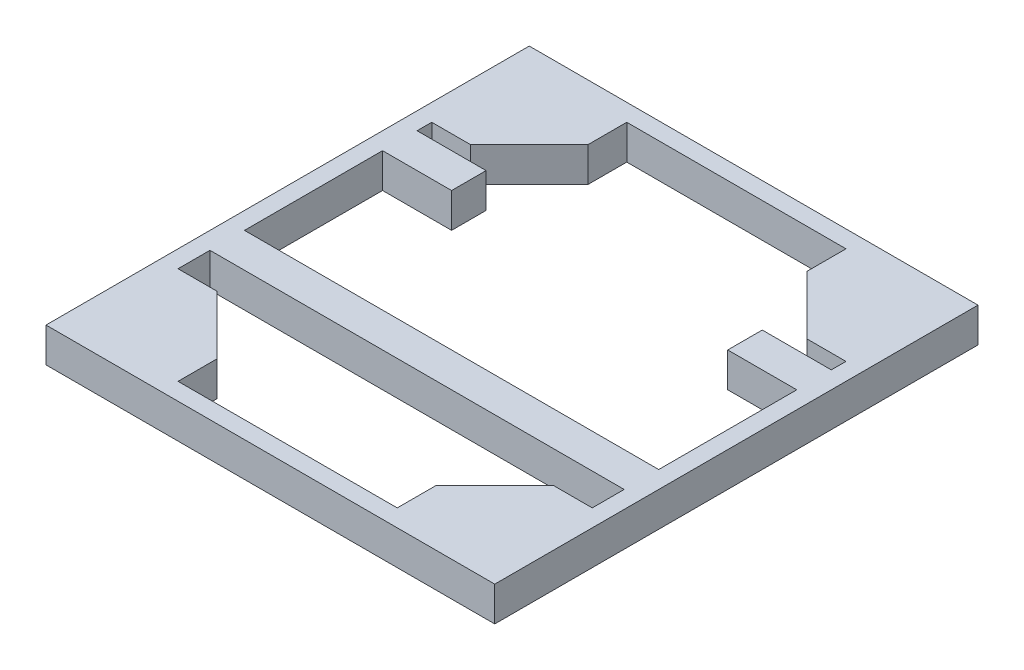
ISO-10303-21;
HEADER;
FILE_DESCRIPTION(('STEP AP214'),'2;1');
FILE_NAME('part.step','',(''),(''),'','','');
FILE_SCHEMA(('AUTOMOTIVE_DESIGN { 1 0 10303 214 1 1 1 1 }'));
ENDSEC;
DATA;
#1=APPLICATION_CONTEXT('core data for automotive mechanical design processes');
#2=APPLICATION_PROTOCOL_DEFINITION('international standard','automotive_design',2000,#1);
#3=PRODUCT_CONTEXT('',#1,'mechanical');
#4=PRODUCT('Part','Part','',(#3));
#5=PRODUCT_RELATED_PRODUCT_CATEGORY('part','',(#4));
#6=PRODUCT_DEFINITION_FORMATION('','',#4);
#7=PRODUCT_DEFINITION_CONTEXT('part definition',#1,'design');
#8=PRODUCT_DEFINITION('design','',#6,#7);
#9=PRODUCT_DEFINITION_SHAPE('','',#8);
#10=(LENGTH_UNIT() NAMED_UNIT(*) SI_UNIT(.MILLI.,.METRE.));
#11=(NAMED_UNIT(*) PLANE_ANGLE_UNIT() SI_UNIT($,.RADIAN.));
#12=(NAMED_UNIT(*) SI_UNIT($,.STERADIAN.) SOLID_ANGLE_UNIT());
#13=UNCERTAINTY_MEASURE_WITH_UNIT(LENGTH_MEASURE(1.E-05),#10,'distance_accuracy_value','');
#14=(GEOMETRIC_REPRESENTATION_CONTEXT(3) GLOBAL_UNCERTAINTY_ASSIGNED_CONTEXT((#13)) GLOBAL_UNIT_ASSIGNED_CONTEXT((#10,
#11,#12)) REPRESENTATION_CONTEXT('',''));
#15=CARTESIAN_POINT('',(0.,0.,0.));
#16=DIRECTION('',(0.,0.,1.));
#17=DIRECTION('',(1.,0.,0.));
#18=AXIS2_PLACEMENT_3D('',#15,#16,#17);
#19=CARTESIAN_POINT('',(0.,0.,-469.9));
#20=DIRECTION('',(0.,0.,-1.));
#21=DIRECTION('',(-1.,0.,0.));
#22=AXIS2_PLACEMENT_3D('',#19,#20,#21);
#23=PLANE('',#22);
#24=DIRECTION('',(-1.,0.,0.));
#25=VECTOR('',#24,1.);
#26=CARTESIAN_POINT('',(0.,50.8,-469.9));
#27=LINE('',#26,#25);
#28=CARTESIAN_POINT('',(635.,50.8,-469.9));
#29=VERTEX_POINT('',#28);
#30=CARTESIAN_POINT('',(533.4,50.8,-469.9));
#31=VERTEX_POINT('',#30);
#32=EDGE_CURVE('E272',#29,#31,#27,.T.);
#33=ORIENTED_EDGE('',*,*,#32,.T.);
#34=DIRECTION('',(0.,1.,0.));
#35=VECTOR('',#34,1.);
#36=CARTESIAN_POINT('',(533.4,0.,-469.9));
#37=LINE('',#36,#35);
#38=CARTESIAN_POINT('',(533.4,0.,-469.9));
#39=VERTEX_POINT('',#38);
#40=EDGE_CURVE('E565',#39,#31,#37,.T.);
#41=ORIENTED_EDGE('',*,*,#40,.F.);
#42=DIRECTION('',(-1.,0.,0.));
#43=VECTOR('',#42,1.);
#44=CARTESIAN_POINT('',(0.,0.,-469.9));
#45=LINE('',#44,#43);
#46=CARTESIAN_POINT('',(635.,0.,-469.9));
#47=VERTEX_POINT('',#46);
#48=EDGE_CURVE('E262',#47,#39,#45,.T.);
#49=ORIENTED_EDGE('',*,*,#48,.F.);
#50=DIRECTION('',(0.,1.,0.));
#51=VECTOR('',#50,1.);
#52=CARTESIAN_POINT('',(635.,0.,-469.9));
#53=LINE('',#52,#51);
#54=EDGE_CURVE('E281',#47,#29,#53,.T.);
#55=ORIENTED_EDGE('',*,*,#54,.T.);
#56=EDGE_LOOP('',(#33,#41,#49,#55));
#57=FACE_BOUND('',#56,.T.);
#58=ADVANCED_FACE('F35',(#57),#23,.F.);
#59=CARTESIAN_POINT('',(0.,0.,-520.7));
#60=DIRECTION('',(0.,0.,-1.));
#61=DIRECTION('',(-1.,0.,0.));
#62=AXIS2_PLACEMENT_3D('',#59,#60,#61);
#63=PLANE('',#62);
#64=DIRECTION('',(0.,1.,0.));
#65=VECTOR('',#64,1.);
#66=CARTESIAN_POINT('',(533.4,0.,-520.7));
#67=LINE('',#66,#65);
#68=CARTESIAN_POINT('',(533.4,0.,-520.7));
#69=VERTEX_POINT('',#68);
#70=CARTESIAN_POINT('',(533.4,50.8,-520.7));
#71=VERTEX_POINT('',#70);
#72=EDGE_CURVE('E243',#69,#71,#67,.T.);
#73=ORIENTED_EDGE('',*,*,#72,.T.);
#74=DIRECTION('',(-1.,0.,0.));
#75=VECTOR('',#74,1.);
#76=CARTESIAN_POINT('',(0.,50.8,-520.7));
#77=LINE('',#76,#75);
#78=CARTESIAN_POINT('',(635.,50.8,-520.7));
#79=VERTEX_POINT('',#78);
#80=EDGE_CURVE('E275',#79,#71,#77,.T.);
#81=ORIENTED_EDGE('',*,*,#80,.F.);
#82=DIRECTION('',(0.,1.,0.));
#83=VECTOR('',#82,1.);
#84=CARTESIAN_POINT('',(635.,0.,-520.7));
#85=LINE('',#84,#83);
#86=CARTESIAN_POINT('',(635.,0.,-520.7));
#87=VERTEX_POINT('',#86);
#88=EDGE_CURVE('E267',#87,#79,#85,.T.);
#89=ORIENTED_EDGE('',*,*,#88,.F.);
#90=DIRECTION('',(-1.,0.,0.));
#91=VECTOR('',#90,1.);
#92=CARTESIAN_POINT('',(0.,0.,-520.7));
#93=LINE('',#92,#91);
#94=EDGE_CURVE('E260',#87,#69,#93,.T.);
#95=ORIENTED_EDGE('',*,*,#94,.T.);
#96=EDGE_LOOP('',(#73,#81,#89,#95));
#97=FACE_BOUND('',#96,.T.);
#98=ADVANCED_FACE('F266',(#97),#63,.T.);
#99=CARTESIAN_POINT('',(25.3999999999999,50.8,0.));
#100=DIRECTION('',(1.,0.,0.));
#101=DIRECTION('',(0.,0.,-1.));
#102=AXIS2_PLACEMENT_3D('',#99,#100,#101);
#103=PLANE('',#102);
#104=DIRECTION('',(0.,0.,1.));
#105=VECTOR('',#104,1.);
#106=CARTESIAN_POINT('',(25.3999999999999,0.,0.));
#107=LINE('',#106,#105);
#108=CARTESIAN_POINT('',(25.3999999999999,0.,-469.9));
#109=VERTEX_POINT('',#108);
#110=CARTESIAN_POINT('',(25.3999999999999,0.,-266.7));
#111=VERTEX_POINT('',#110);
#112=EDGE_CURVE('E390',#109,#111,#107,.T.);
#113=ORIENTED_EDGE('',*,*,#112,.F.);
#114=DIRECTION('',(0.,1.,0.));
#115=VECTOR('',#114,1.);
#116=CARTESIAN_POINT('',(25.3999999999999,0.,-469.9));
#117=LINE('',#116,#115);
#118=CARTESIAN_POINT('',(25.3999999999999,50.8,-469.9));
#119=VERTEX_POINT('',#118);
#120=EDGE_CURVE('E285',#109,#119,#117,.T.);
#121=ORIENTED_EDGE('',*,*,#120,.T.);
#122=DIRECTION('',(0.,0.,1.));
#123=VECTOR('',#122,1.);
#124=CARTESIAN_POINT('',(25.3999999999999,50.8,0.));
#125=LINE('',#124,#123);
#126=CARTESIAN_POINT('',(25.3999999999999,50.8,-266.7));
#127=VERTEX_POINT('',#126);
#128=EDGE_CURVE('E333',#119,#127,#125,.T.);
#129=ORIENTED_EDGE('',*,*,#128,.T.);
#130=DIRECTION('',(0.,1.,0.));
#131=VECTOR('',#130,1.);
#132=CARTESIAN_POINT('',(25.3999999999999,0.,-266.7));
#133=LINE('',#132,#131);
#134=EDGE_CURVE('E310',#111,#127,#133,.T.);
#135=ORIENTED_EDGE('',*,*,#134,.F.);
#136=EDGE_LOOP('',(#113,#121,#129,#135));
#137=FACE_BOUND('',#136,.T.);
#138=ADVANCED_FACE('F526',(#137),#103,.T.);
#139=CARTESIAN_POINT('',(635.,50.8,0.));
#140=DIRECTION('',(1.,0.,0.));
#141=DIRECTION('',(0.,0.,-1.));
#142=AXIS2_PLACEMENT_3D('',#139,#140,#141);
#143=PLANE('',#142);
#144=ORIENTED_EDGE('',*,*,#54,.F.);
#145=DIRECTION('',(0.,0.,1.));
#146=VECTOR('',#145,1.);
#147=CARTESIAN_POINT('',(635.,0.,0.));
#148=LINE('',#147,#146);
#149=CARTESIAN_POINT('',(635.,0.,-266.7));
#150=VERTEX_POINT('',#149);
#151=EDGE_CURVE('E412',#47,#150,#148,.T.);
#152=ORIENTED_EDGE('',*,*,#151,.T.);
#153=DIRECTION('',(0.,1.,0.));
#154=VECTOR('',#153,1.);
#155=CARTESIAN_POINT('',(635.,0.,-266.7));
#156=LINE('',#155,#154);
#157=CARTESIAN_POINT('',(635.,50.8,-266.7));
#158=VERTEX_POINT('',#157);
#159=EDGE_CURVE('E299',#150,#158,#156,.T.);
#160=ORIENTED_EDGE('',*,*,#159,.T.);
#161=DIRECTION('',(0.,0.,1.));
#162=VECTOR('',#161,1.);
#163=CARTESIAN_POINT('',(635.,50.8,0.));
#164=LINE('',#163,#162);
#165=EDGE_CURVE('E355',#29,#158,#164,.T.);
#166=ORIENTED_EDGE('',*,*,#165,.F.);
#167=EDGE_LOOP('',(#144,#152,#160,#166));
#168=FACE_BOUND('',#167,.T.);
#169=ADVANCED_FACE('F512',(#168),#143,.F.);
#170=CARTESIAN_POINT('',(25.3999999999999,0.,-215.9));
#171=VERTEX_POINT('',#170);
#172=CARTESIAN_POINT('',(25.3999999999999,0.,-168.897171389936));
#173=VERTEX_POINT('',#172);
#174=EDGE_CURVE('E385',#171,#173,#107,.T.);
#175=ORIENTED_EDGE('',*,*,#174,.F.);
#176=DIRECTION('',(0.,1.,0.));
#177=VECTOR('',#176,1.);
#178=CARTESIAN_POINT('',(25.3999999999999,0.,-215.9));
#179=LINE('',#178,#177);
#180=CARTESIAN_POINT('',(25.3999999999999,50.8,-215.9));
#181=VERTEX_POINT('',#180);
#182=EDGE_CURVE('E307',#171,#181,#179,.T.);
#183=ORIENTED_EDGE('',*,*,#182,.T.);
#184=CARTESIAN_POINT('',(25.3999999999999,50.8,-168.897171389936));
#185=VERTEX_POINT('',#184);
#186=EDGE_CURVE('E328',#181,#185,#125,.T.);
#187=ORIENTED_EDGE('',*,*,#186,.T.);
#188=DIRECTION('',(0.,-1.,0.));
#189=VECTOR('',#188,1.);
#190=CARTESIAN_POINT('',(25.3999999999999,50.8,-168.897171389936));
#191=LINE('',#190,#189);
#192=EDGE_CURVE('E464',#185,#173,#191,.T.);
#193=ORIENTED_EDGE('',*,*,#192,.T.);
#194=EDGE_LOOP('',(#175,#183,#187,#193));
#195=FACE_BOUND('',#194,.T.);
#196=ADVANCED_FACE('F524',(#195),#103,.T.);
#197=DIRECTION('',(0.,1.,0.));
#198=VECTOR('',#197,1.);
#199=CARTESIAN_POINT('',(635.,0.,-215.9));
#200=LINE('',#199,#198);
#201=CARTESIAN_POINT('',(635.,0.,-215.9));
#202=VERTEX_POINT('',#201);
#203=CARTESIAN_POINT('',(635.,50.8,-215.9));
#204=VERTEX_POINT('',#203);
#205=EDGE_CURVE('E303',#202,#204,#200,.T.);
#206=ORIENTED_EDGE('',*,*,#205,.F.);
#207=CARTESIAN_POINT('',(635.,0.,-168.897171389936));
#208=VERTEX_POINT('',#207);
#209=EDGE_CURVE('E408',#202,#208,#148,.T.);
#210=ORIENTED_EDGE('',*,*,#209,.T.);
#211=DIRECTION('',(0.,-1.,0.));
#212=VECTOR('',#211,1.);
#213=CARTESIAN_POINT('',(635.,50.8,-168.897171389936));
#214=LINE('',#213,#212);
#215=CARTESIAN_POINT('',(635.,50.8,-168.897171389936));
#216=VERTEX_POINT('',#215);
#217=EDGE_CURVE('E442',#216,#208,#214,.T.);
#218=ORIENTED_EDGE('',*,*,#217,.F.);
#219=EDGE_CURVE('E350',#204,#216,#164,.T.);
#220=ORIENTED_EDGE('',*,*,#219,.F.);
#221=EDGE_LOOP('',(#206,#210,#218,#220));
#222=FACE_BOUND('',#221,.T.);
#223=ADVANCED_FACE('F507',(#222),#143,.F.);
#224=CARTESIAN_POINT('',(0.,50.8,0.));
#225=DIRECTION('',(0.,0.,-1.));
#226=DIRECTION('',(-1.,0.,0.));
#227=AXIS2_PLACEMENT_3D('',#224,#225,#226);
#228=PLANE('',#227);
#229=DIRECTION('',(1.,0.,0.));
#230=VECTOR('',#229,1.);
#231=CARTESIAN_POINT('',(0.,0.,0.));
#232=LINE('',#231,#230);
#233=CARTESIAN_POINT('',(0.,0.,0.));
#234=VERTEX_POINT('',#233);
#235=CARTESIAN_POINT('',(660.4,0.,0.));
#236=VERTEX_POINT('',#235);
#237=EDGE_CURVE('E420',#234,#236,#232,.T.);
#238=ORIENTED_EDGE('',*,*,#237,.T.);
#239=DIRECTION('',(0.,-1.,0.));
#240=VECTOR('',#239,1.);
#241=CARTESIAN_POINT('',(660.4,50.8,0.));
#242=LINE('',#241,#240);
#243=CARTESIAN_POINT('',(660.4,50.8,0.));
#244=VERTEX_POINT('',#243);
#245=EDGE_CURVE('E11',#244,#236,#242,.T.);
#246=ORIENTED_EDGE('',*,*,#245,.F.);
#247=DIRECTION('',(1.,0.,0.));
#248=VECTOR('',#247,1.);
#249=CARTESIAN_POINT('',(0.,50.8,0.));
#250=LINE('',#249,#248);
#251=CARTESIAN_POINT('',(0.,50.8,0.));
#252=VERTEX_POINT('',#251);
#253=EDGE_CURVE('E362',#252,#244,#250,.T.);
#254=ORIENTED_EDGE('',*,*,#253,.F.);
#255=DIRECTION('',(0.,-1.,0.));
#256=VECTOR('',#255,1.);
#257=CARTESIAN_POINT('',(0.,50.8,0.));
#258=LINE('',#257,#256);
#259=EDGE_CURVE('E431',#252,#234,#258,.T.);
#260=ORIENTED_EDGE('',*,*,#259,.T.);
#261=EDGE_LOOP('',(#238,#246,#254,#260));
#262=FACE_BOUND('',#261,.T.);
#263=ADVANCED_FACE('F668',(#262),#228,.F.);
#264=CARTESIAN_POINT('',(660.4,50.8,0.));
#265=DIRECTION('',(-1.,0.,0.));
#266=DIRECTION('',(0.,0.,1.));
#267=AXIS2_PLACEMENT_3D('',#264,#265,#266);
#268=PLANE('',#267);
#269=DIRECTION('',(0.,0.,-1.));
#270=VECTOR('',#269,1.);
#271=CARTESIAN_POINT('',(660.4,0.,0.));
#272=LINE('',#271,#270);
#273=CARTESIAN_POINT('',(660.4,0.,-711.2));
#274=VERTEX_POINT('',#273);
#275=EDGE_CURVE('E423',#236,#274,#272,.T.);
#276=ORIENTED_EDGE('',*,*,#275,.T.);
#277=DIRECTION('',(0.,-1.,0.));
#278=VECTOR('',#277,1.);
#279=CARTESIAN_POINT('',(660.4,50.8,-711.2));
#280=LINE('',#279,#278);
#281=CARTESIAN_POINT('',(660.4,50.8,-711.2));
#282=VERTEX_POINT('',#281);
#283=EDGE_CURVE('E44',#282,#274,#280,.T.);
#284=ORIENTED_EDGE('',*,*,#283,.F.);
#285=DIRECTION('',(0.,0.,-1.));
#286=VECTOR('',#285,1.);
#287=CARTESIAN_POINT('',(660.4,50.8,0.));
#288=LINE('',#287,#286);
#289=EDGE_CURVE('E365',#244,#282,#288,.T.);
#290=ORIENTED_EDGE('',*,*,#289,.F.);
#291=ORIENTED_EDGE('',*,*,#245,.T.);
#292=EDGE_LOOP('',(#276,#284,#290,#291));
#293=FACE_BOUND('',#292,.T.);
#294=ADVANCED_FACE('F823',(#293),#268,.F.);
#295=CARTESIAN_POINT('',(0.,50.8,-711.2));
#296=DIRECTION('',(0.,0.,-1.));
#297=DIRECTION('',(-1.,0.,0.));
#298=AXIS2_PLACEMENT_3D('',#295,#296,#297);
#299=PLANE('',#298);
#300=DIRECTION('',(1.,0.,0.));
#301=VECTOR('',#300,1.);
#302=CARTESIAN_POINT('',(0.,0.,-711.2));
#303=LINE('',#302,#301);
#304=CARTESIAN_POINT('',(0.,0.,-711.2));
#305=VERTEX_POINT('',#304);
#306=EDGE_CURVE('E426',#305,#274,#303,.T.);
#307=ORIENTED_EDGE('',*,*,#306,.F.);
#308=DIRECTION('',(0.,-1.,0.));
#309=VECTOR('',#308,1.);
#310=CARTESIAN_POINT('',(0.,50.8,-711.2));
#311=LINE('',#310,#309);
#312=CARTESIAN_POINT('',(0.,50.8,-711.2));
#313=VERTEX_POINT('',#312);
#314=EDGE_CURVE('E433',#313,#305,#311,.T.);
#315=ORIENTED_EDGE('',*,*,#314,.F.);
#316=DIRECTION('',(1.,0.,0.));
#317=VECTOR('',#316,1.);
#318=CARTESIAN_POINT('',(0.,50.8,-711.2));
#319=LINE('',#318,#317);
#320=EDGE_CURVE('E367',#313,#282,#319,.T.);
#321=ORIENTED_EDGE('',*,*,#320,.T.);
#322=ORIENTED_EDGE('',*,*,#283,.T.);
#323=EDGE_LOOP('',(#307,#315,#321,#322));
#324=FACE_BOUND('',#323,.T.);
#325=ADVANCED_FACE('F815',(#324),#299,.T.);
#326=CARTESIAN_POINT('',(0.,50.8,-25.4));
#327=DIRECTION('',(0.,0.,-1.));
#328=DIRECTION('',(-1.,0.,0.));
#329=AXIS2_PLACEMENT_3D('',#326,#327,#328);
#330=PLANE('',#329);
#331=DIRECTION('',(1.,0.,0.));
#332=VECTOR('',#331,1.);
#333=CARTESIAN_POINT('',(0.,0.,-25.4));
#334=LINE('',#333,#332);
#335=CARTESIAN_POINT('',(168.897171389937,0.,-25.4));
#336=VERTEX_POINT('',#335);
#337=CARTESIAN_POINT('',(491.502828610063,0.,-25.4));
#338=VERTEX_POINT('',#337);
#339=EDGE_CURVE('E306',#336,#338,#334,.T.);
#340=ORIENTED_EDGE('',*,*,#339,.F.);
#341=DIRECTION('',(0.,-1.,0.));
#342=VECTOR('',#341,1.);
#343=CARTESIAN_POINT('',(168.897171389937,50.8,-25.4));
#344=LINE('',#343,#342);
#345=CARTESIAN_POINT('',(168.897171389937,50.8,-25.4));
#346=VERTEX_POINT('',#345);
#347=EDGE_CURVE('E39',#346,#336,#344,.T.);
#348=ORIENTED_EDGE('',*,*,#347,.F.);
#349=DIRECTION('',(1.,0.,0.));
#350=VECTOR('',#349,1.);
#351=CARTESIAN_POINT('',(0.,50.8,-25.4));
#352=LINE('',#351,#350);
#353=CARTESIAN_POINT('',(491.502828610063,50.8,-25.4));
#354=VERTEX_POINT('',#353);
#355=EDGE_CURVE('E315',#346,#354,#352,.T.);
#356=ORIENTED_EDGE('',*,*,#355,.T.);
#357=DIRECTION('',(0.,-1.,0.));
#358=VECTOR('',#357,1.);
#359=CARTESIAN_POINT('',(491.502828610063,50.8,-25.4));
#360=LINE('',#359,#358);
#361=EDGE_CURVE('E373',#354,#338,#360,.T.);
#362=ORIENTED_EDGE('',*,*,#361,.T.);
#363=EDGE_LOOP('',(#340,#348,#356,#362));
#364=FACE_BOUND('',#363,.T.);
#365=ADVANCED_FACE('F37',(#364),#330,.T.);
#366=CARTESIAN_POINT('',(168.897171389937,50.8,1.2304037301258E-12));
#367=DIRECTION('',(1.,0.,0.));
#368=DIRECTION('',(0.,0.,-1.));
#369=AXIS2_PLACEMENT_3D('',#366,#367,#368);
#370=PLANE('',#369);
#371=DIRECTION('',(0.,0.,1.));
#372=VECTOR('',#371,1.);
#373=CARTESIAN_POINT('',(168.897171389937,0.,1.2304037301258E-12));
#374=LINE('',#373,#372);
#375=CARTESIAN_POINT('',(168.897171389937,0.,-82.5499999999992));
#376=VERTEX_POINT('',#375);
#377=EDGE_CURVE('E376',#376,#336,#374,.T.);
#378=ORIENTED_EDGE('',*,*,#377,.F.);
#379=DIRECTION('',(0.,-1.,0.));
#380=VECTOR('',#379,1.);
#381=CARTESIAN_POINT('',(168.897171389937,50.8,-82.5499999999992));
#382=LINE('',#381,#380);
#383=CARTESIAN_POINT('',(168.897171389937,50.8,-82.5499999999992));
#384=VERTEX_POINT('',#383);
#385=EDGE_CURVE('E468',#384,#376,#382,.T.);
#386=ORIENTED_EDGE('',*,*,#385,.F.);
#387=DIRECTION('',(0.,0.,1.));
#388=VECTOR('',#387,1.);
#389=CARTESIAN_POINT('',(168.897171389937,50.8,1.2304037301258E-12));
#390=LINE('',#389,#388);
#391=EDGE_CURVE('E318',#384,#346,#390,.T.);
#392=ORIENTED_EDGE('',*,*,#391,.T.);
#393=ORIENTED_EDGE('',*,*,#347,.T.);
#394=EDGE_LOOP('',(#378,#386,#392,#393));
#395=FACE_BOUND('',#394,.T.);
#396=ADVANCED_FACE('F474',(#395),#370,.T.);
#397=CARTESIAN_POINT('',(125.723585694968,50.8,-125.723585694968));
#398=DIRECTION('',(0.707106781186549,0.,-0.707106781186546));
#399=DIRECTION('',(-0.707106781186546,0.,-0.707106781186549));
#400=AXIS2_PLACEMENT_3D('',#397,#398,#399);
#401=PLANE('',#400);
#402=DIRECTION('',(0.707106781186546,0.,0.707106781186549));
#403=VECTOR('',#402,1.);
#404=CARTESIAN_POINT('',(125.723585694968,0.,-125.723585694968));
#405=LINE('',#404,#403);
#406=CARTESIAN_POINT('',(82.5500000000016,0.,-168.897171389935));
#407=VERTEX_POINT('',#406);
#408=EDGE_CURVE('E379',#407,#376,#405,.T.);
#409=ORIENTED_EDGE('',*,*,#408,.F.);
#410=DIRECTION('',(0.,-1.,0.));
#411=VECTOR('',#410,1.);
#412=CARTESIAN_POINT('',(82.5500000000016,50.8,-168.897171389935));
#413=LINE('',#412,#411);
#414=CARTESIAN_POINT('',(82.5500000000016,50.8,-168.897171389935));
#415=VERTEX_POINT('',#414);
#416=EDGE_CURVE('E467',#415,#407,#413,.T.);
#417=ORIENTED_EDGE('',*,*,#416,.F.);
#418=DIRECTION('',(0.707106781186546,0.,0.707106781186549));
#419=VECTOR('',#418,1.);
#420=CARTESIAN_POINT('',(125.723585694968,50.8,-125.723585694968));
#421=LINE('',#420,#419);
#422=EDGE_CURVE('E322',#415,#384,#421,.T.);
#423=ORIENTED_EDGE('',*,*,#422,.T.);
#424=ORIENTED_EDGE('',*,*,#385,.T.);
#425=EDGE_LOOP('',(#409,#417,#423,#424));
#426=FACE_BOUND('',#425,.T.);
#427=ADVANCED_FACE('F482',(#426),#401,.T.);
#428=CARTESIAN_POINT('',(4.59350725913613E-12,50.8,-168.897171389937));
#429=DIRECTION('',(0.,0.,1.));
#430=DIRECTION('',(1.,0.,0.));
#431=AXIS2_PLACEMENT_3D('',#428,#429,#430);
#432=PLANE('',#431);
#433=DIRECTION('',(-1.,0.,0.));
#434=VECTOR('',#433,1.);
#435=CARTESIAN_POINT('',(4.59350725913613E-12,0.,-168.897171389937));
#436=LINE('',#435,#434);
#437=EDGE_CURVE('E382',#407,#173,#436,.T.);
#438=ORIENTED_EDGE('',*,*,#437,.T.);
#439=ORIENTED_EDGE('',*,*,#192,.F.);
#440=DIRECTION('',(-1.,0.,0.));
#441=VECTOR('',#440,1.);
#442=CARTESIAN_POINT('',(4.59350725913613E-12,50.8,-168.897171389937));
#443=LINE('',#442,#441);
#444=EDGE_CURVE('E325',#415,#185,#443,.T.);
#445=ORIENTED_EDGE('',*,*,#444,.F.);
#446=ORIENTED_EDGE('',*,*,#416,.T.);
#447=EDGE_LOOP('',(#438,#439,#445,#446));
#448=FACE_BOUND('',#447,.T.);
#449=ADVANCED_FACE('F487',(#448),#432,.F.);
#450=DIRECTION('',(0.,1.,0.));
#451=VECTOR('',#450,1.);
#452=CARTESIAN_POINT('',(25.3999999999999,0.,-520.7));
#453=LINE('',#452,#451);
#454=CARTESIAN_POINT('',(25.3999999999999,0.,-520.7));
#455=VERTEX_POINT('',#454);
#456=CARTESIAN_POINT('',(25.3999999999999,50.8,-520.7));
#457=VERTEX_POINT('',#456);
#458=EDGE_CURVE('E288',#455,#457,#453,.T.);
#459=ORIENTED_EDGE('',*,*,#458,.F.);
#460=CARTESIAN_POINT('',(25.3999999999999,0.,-542.302828610064));
#461=VERTEX_POINT('',#460);
#462=EDGE_CURVE('E386',#461,#455,#107,.T.);
#463=ORIENTED_EDGE('',*,*,#462,.F.);
#464=DIRECTION('',(0.,-1.,0.));
#465=VECTOR('',#464,1.);
#466=CARTESIAN_POINT('',(25.3999999999999,50.8,-542.302828610064));
#467=LINE('',#466,#465);
#468=CARTESIAN_POINT('',(25.3999999999999,50.8,-542.302828610064));
#469=VERTEX_POINT('',#468);
#470=EDGE_CURVE('E462',#469,#461,#467,.T.);
#471=ORIENTED_EDGE('',*,*,#470,.F.);
#472=EDGE_CURVE('E329',#469,#457,#125,.T.);
#473=ORIENTED_EDGE('',*,*,#472,.T.);
#474=EDGE_LOOP('',(#459,#463,#471,#473));
#475=FACE_BOUND('',#474,.T.);
#476=ADVANCED_FACE('F649',(#475),#103,.T.);
#477=CARTESIAN_POINT('',(-1.47490449921105E-11,50.8,-542.302828610063));
#478=DIRECTION('',(0.,0.,1.));
#479=DIRECTION('',(1.,0.,0.));
#480=AXIS2_PLACEMENT_3D('',#477,#478,#479);
#481=PLANE('',#480);
#482=DIRECTION('',(-1.,0.,0.));
#483=VECTOR('',#482,1.);
#484=CARTESIAN_POINT('',(-1.47490449921105E-11,0.,-542.302828610063));
#485=LINE('',#484,#483);
#486=CARTESIAN_POINT('',(82.5500000000016,0.,-542.302828610065));
#487=VERTEX_POINT('',#486);
#488=EDGE_CURVE('E389',#487,#461,#485,.T.);
#489=ORIENTED_EDGE('',*,*,#488,.F.);
#490=DIRECTION('',(0.,-1.,0.));
#491=VECTOR('',#490,1.);
#492=CARTESIAN_POINT('',(82.5500000000016,50.8,-542.302828610065));
#493=LINE('',#492,#491);
#494=CARTESIAN_POINT('',(82.5500000000016,50.8,-542.302828610065));
#495=VERTEX_POINT('',#494);
#496=EDGE_CURVE('E460',#495,#487,#493,.T.);
#497=ORIENTED_EDGE('',*,*,#496,.F.);
#498=DIRECTION('',(-1.,0.,0.));
#499=VECTOR('',#498,1.);
#500=CARTESIAN_POINT('',(-1.47490449921105E-11,50.8,-542.302828610063));
#501=LINE('',#500,#499);
#502=EDGE_CURVE('E332',#495,#469,#501,.T.);
#503=ORIENTED_EDGE('',*,*,#502,.T.);
#504=ORIENTED_EDGE('',*,*,#470,.T.);
#505=EDGE_LOOP('',(#489,#497,#503,#504));
#506=FACE_BOUND('',#505,.T.);
#507=ADVANCED_FACE('F654',(#506),#481,.T.);
#508=CARTESIAN_POINT('',(-229.876414305032,50.8,-229.876414305031));
#509=DIRECTION('',(-0.707106781186549,0.,-0.707106781186546));
#510=DIRECTION('',(-0.707106781186546,0.,0.707106781186549));
#511=AXIS2_PLACEMENT_3D('',#508,#509,#510);
#512=PLANE('',#511);
#513=DIRECTION('',(0.707106781186546,0.,-0.707106781186549));
#514=VECTOR('',#513,1.);
#515=CARTESIAN_POINT('',(-229.876414305032,0.,-229.876414305031));
#516=LINE('',#515,#514);
#517=CARTESIAN_POINT('',(168.897171389937,0.,-628.650000000001));
#518=VERTEX_POINT('',#517);
#519=EDGE_CURVE('E393',#487,#518,#516,.T.);
#520=ORIENTED_EDGE('',*,*,#519,.T.);
#521=DIRECTION('',(0.,-1.,0.));
#522=VECTOR('',#521,1.);
#523=CARTESIAN_POINT('',(168.897171389937,50.8,-628.650000000001));
#524=LINE('',#523,#522);
#525=CARTESIAN_POINT('',(168.897171389937,50.8,-628.650000000001));
#526=VERTEX_POINT('',#525);
#527=EDGE_CURVE('E457',#526,#518,#524,.T.);
#528=ORIENTED_EDGE('',*,*,#527,.F.);
#529=DIRECTION('',(0.707106781186546,0.,-0.707106781186549));
#530=VECTOR('',#529,1.);
#531=CARTESIAN_POINT('',(-229.876414305032,50.8,-229.876414305031));
#532=LINE('',#531,#530);
#533=EDGE_CURVE('E336',#495,#526,#532,.T.);
#534=ORIENTED_EDGE('',*,*,#533,.F.);
#535=ORIENTED_EDGE('',*,*,#496,.T.);
#536=EDGE_LOOP('',(#520,#528,#534,#535));
#537=FACE_BOUND('',#536,.T.);
#538=ADVANCED_FACE('F768',(#537),#512,.F.);
#539=CARTESIAN_POINT('',(168.897171389942,50.8,-1.23040373012584E-12));
#540=DIRECTION('',(-1.,0.,0.));
#541=DIRECTION('',(0.,0.,1.));
#542=AXIS2_PLACEMENT_3D('',#539,#540,#541);
#543=PLANE('',#542);
#544=DIRECTION('',(0.,0.,-1.));
#545=VECTOR('',#544,1.);
#546=CARTESIAN_POINT('',(168.897171389942,0.,-1.23040373012584E-12));
#547=LINE('',#546,#545);
#548=CARTESIAN_POINT('',(168.897171389937,0.,-685.8));
#549=VERTEX_POINT('',#548);
#550=EDGE_CURVE('E395',#518,#549,#547,.T.);
#551=ORIENTED_EDGE('',*,*,#550,.T.);
#552=DIRECTION('',(0.,-1.,0.));
#553=VECTOR('',#552,1.);
#554=CARTESIAN_POINT('',(168.897171389937,50.8,-685.8));
#555=LINE('',#554,#553);
#556=CARTESIAN_POINT('',(168.897171389937,50.8,-685.8));
#557=VERTEX_POINT('',#556);
#558=EDGE_CURVE('E454',#557,#549,#555,.T.);
#559=ORIENTED_EDGE('',*,*,#558,.F.);
#560=DIRECTION('',(0.,0.,-1.));
#561=VECTOR('',#560,1.);
#562=CARTESIAN_POINT('',(168.897171389942,50.8,-1.23040373012584E-12));
#563=LINE('',#562,#561);
#564=EDGE_CURVE('E338',#526,#557,#563,.T.);
#565=ORIENTED_EDGE('',*,*,#564,.F.);
#566=ORIENTED_EDGE('',*,*,#527,.T.);
#567=EDGE_LOOP('',(#551,#559,#565,#566));
#568=FACE_BOUND('',#567,.T.);
#569=ADVANCED_FACE('F758',(#568),#543,.F.);
#570=CARTESIAN_POINT('',(0.,50.8,-685.8));
#571=DIRECTION('',(0.,0.,-1.));
#572=DIRECTION('',(-1.,0.,0.));
#573=AXIS2_PLACEMENT_3D('',#570,#571,#572);
#574=PLANE('',#573);
#575=DIRECTION('',(1.,0.,0.));
#576=VECTOR('',#575,1.);
#577=CARTESIAN_POINT('',(0.,0.,-685.8));
#578=LINE('',#577,#576);
#579=CARTESIAN_POINT('',(491.502828610063,0.,-685.8));
#580=VERTEX_POINT('',#579);
#581=EDGE_CURVE('E397',#549,#580,#578,.T.);
#582=ORIENTED_EDGE('',*,*,#581,.T.);
#583=DIRECTION('',(0.,-1.,0.));
#584=VECTOR('',#583,1.);
#585=CARTESIAN_POINT('',(491.502828610063,50.8,-685.8));
#586=LINE('',#585,#584);
#587=CARTESIAN_POINT('',(491.502828610063,50.8,-685.8));
#588=VERTEX_POINT('',#587);
#589=EDGE_CURVE('E452',#588,#580,#586,.T.);
#590=ORIENTED_EDGE('',*,*,#589,.F.);
#591=DIRECTION('',(1.,0.,0.));
#592=VECTOR('',#591,1.);
#593=CARTESIAN_POINT('',(0.,50.8,-685.8));
#594=LINE('',#593,#592);
#595=EDGE_CURVE('E340',#557,#588,#594,.T.);
#596=ORIENTED_EDGE('',*,*,#595,.F.);
#597=ORIENTED_EDGE('',*,*,#558,.T.);
#598=EDGE_LOOP('',(#582,#590,#596,#597));
#599=FACE_BOUND('',#598,.T.);
#600=ADVANCED_FACE('F748',(#599),#574,.F.);
#601=CARTESIAN_POINT('',(491.502828610059,50.8,3.34185852925548E-12));
#602=DIRECTION('',(-1.,0.,0.));
#603=DIRECTION('',(0.,0.,1.));
#604=AXIS2_PLACEMENT_3D('',#601,#602,#603);
#605=PLANE('',#604);
#606=DIRECTION('',(0.,0.,-1.));
#607=VECTOR('',#606,1.);
#608=CARTESIAN_POINT('',(491.502828610059,0.,3.34185852925548E-12));
#609=LINE('',#608,#607);
#610=CARTESIAN_POINT('',(491.502828610063,0.,-628.650000000001));
#611=VERTEX_POINT('',#610);
#612=EDGE_CURVE('E400',#611,#580,#609,.T.);
#613=ORIENTED_EDGE('',*,*,#612,.F.);
#614=DIRECTION('',(0.,-1.,0.));
#615=VECTOR('',#614,1.);
#616=CARTESIAN_POINT('',(491.502828610063,50.8,-628.650000000001));
#617=LINE('',#616,#615);
#618=CARTESIAN_POINT('',(491.502828610063,50.8,-628.650000000001));
#619=VERTEX_POINT('',#618);
#620=EDGE_CURVE('E450',#619,#611,#617,.T.);
#621=ORIENTED_EDGE('',*,*,#620,.F.);
#622=DIRECTION('',(0.,0.,-1.));
#623=VECTOR('',#622,1.);
#624=CARTESIAN_POINT('',(491.502828610059,50.8,3.34185852925548E-12));
#625=LINE('',#624,#623);
#626=EDGE_CURVE('E342',#619,#588,#625,.T.);
#627=ORIENTED_EDGE('',*,*,#626,.T.);
#628=ORIENTED_EDGE('',*,*,#589,.T.);
#629=EDGE_LOOP('',(#613,#621,#627,#628));
#630=FACE_BOUND('',#629,.T.);
#631=ADVANCED_FACE('F738',(#630),#605,.T.);
#632=CARTESIAN_POINT('',(560.076414305033,50.8,-560.076414305031));
#633=DIRECTION('',(-0.707106781186549,0.,0.707106781186546));
#634=DIRECTION('',(0.707106781186546,0.,0.707106781186549));
#635=AXIS2_PLACEMENT_3D('',#632,#633,#634);
#636=PLANE('',#635);
#637=DIRECTION('',(-0.707106781186546,0.,-0.707106781186549));
#638=VECTOR('',#637,1.);
#639=CARTESIAN_POINT('',(560.076414305033,0.,-560.076414305031));
#640=LINE('',#639,#638);
#641=CARTESIAN_POINT('',(577.849999999998,0.,-542.302828610065));
#642=VERTEX_POINT('',#641);
#643=EDGE_CURVE('E403',#642,#611,#640,.T.);
#644=ORIENTED_EDGE('',*,*,#643,.F.);
#645=DIRECTION('',(0.,-1.,0.));
#646=VECTOR('',#645,1.);
#647=CARTESIAN_POINT('',(577.849999999998,50.8,-542.302828610065));
#648=LINE('',#647,#646);
#649=CARTESIAN_POINT('',(577.849999999998,50.8,-542.302828610065));
#650=VERTEX_POINT('',#649);
#651=EDGE_CURVE('E448',#650,#642,#648,.T.);
#652=ORIENTED_EDGE('',*,*,#651,.F.);
#653=DIRECTION('',(-0.707106781186546,0.,-0.707106781186549));
#654=VECTOR('',#653,1.);
#655=CARTESIAN_POINT('',(560.076414305033,50.8,-560.076414305031));
#656=LINE('',#655,#654);
#657=EDGE_CURVE('E345',#650,#619,#656,.T.);
#658=ORIENTED_EDGE('',*,*,#657,.T.);
#659=ORIENTED_EDGE('',*,*,#620,.T.);
#660=EDGE_LOOP('',(#644,#652,#658,#659));
#661=FACE_BOUND('',#660,.T.);
#662=ADVANCED_FACE('F728',(#661),#636,.T.);
#663=CARTESIAN_POINT('',(1.4749044992111E-11,50.8,-542.302828610081));
#664=DIRECTION('',(0.,0.,-1.));
#665=DIRECTION('',(-1.,0.,0.));
#666=AXIS2_PLACEMENT_3D('',#663,#664,#665);
#667=PLANE('',#666);
#668=DIRECTION('',(1.,0.,0.));
#669=VECTOR('',#668,1.);
#670=CARTESIAN_POINT('',(1.4749044992111E-11,0.,-542.302828610081));
#671=LINE('',#670,#669);
#672=CARTESIAN_POINT('',(635.,0.,-542.302828610064));
#673=VERTEX_POINT('',#672);
#674=EDGE_CURVE('E406',#642,#673,#671,.T.);
#675=ORIENTED_EDGE('',*,*,#674,.T.);
#676=DIRECTION('',(0.,-1.,0.));
#677=VECTOR('',#676,1.);
#678=CARTESIAN_POINT('',(635.,50.8,-542.302828610064));
#679=LINE('',#678,#677);
#680=CARTESIAN_POINT('',(635.,50.8,-542.302828610064));
#681=VERTEX_POINT('',#680);
#682=EDGE_CURVE('E445',#681,#673,#679,.T.);
#683=ORIENTED_EDGE('',*,*,#682,.F.);
#684=DIRECTION('',(1.,0.,0.));
#685=VECTOR('',#684,1.);
#686=CARTESIAN_POINT('',(1.4749044992111E-11,50.8,-542.302828610081));
#687=LINE('',#686,#685);
#688=EDGE_CURVE('E348',#650,#681,#687,.T.);
#689=ORIENTED_EDGE('',*,*,#688,.F.);
#690=ORIENTED_EDGE('',*,*,#651,.T.);
#691=EDGE_LOOP('',(#675,#683,#689,#690));
#692=FACE_BOUND('',#691,.T.);
#693=ADVANCED_FACE('F639',(#692),#667,.F.);
#694=EDGE_CURVE('E409',#673,#87,#148,.T.);
#695=ORIENTED_EDGE('',*,*,#694,.T.);
#696=ORIENTED_EDGE('',*,*,#88,.T.);
#697=EDGE_CURVE('E351',#681,#79,#164,.T.);
#698=ORIENTED_EDGE('',*,*,#697,.F.);
#699=ORIENTED_EDGE('',*,*,#682,.T.);
#700=EDGE_LOOP('',(#695,#696,#698,#699));
#701=FACE_BOUND('',#700,.T.);
#702=ADVANCED_FACE('F634',(#701),#143,.F.);
#703=CARTESIAN_POINT('',(-4.59350725913565E-12,50.8,-168.897171389919));
#704=DIRECTION('',(0.,0.,-1.));
#705=DIRECTION('',(-1.,0.,0.));
#706=AXIS2_PLACEMENT_3D('',#703,#704,#705);
#707=PLANE('',#706);
#708=DIRECTION('',(1.,0.,0.));
#709=VECTOR('',#708,1.);
#710=CARTESIAN_POINT('',(-4.59350725913565E-12,0.,-168.897171389919));
#711=LINE('',#710,#709);
#712=CARTESIAN_POINT('',(577.849999999998,0.,-168.897171389935));
#713=VERTEX_POINT('',#712);
#714=EDGE_CURVE('E411',#713,#208,#711,.T.);
#715=ORIENTED_EDGE('',*,*,#714,.F.);
#716=DIRECTION('',(0.,-1.,0.));
#717=VECTOR('',#716,1.);
#718=CARTESIAN_POINT('',(577.849999999998,50.8,-168.897171389935));
#719=LINE('',#718,#717);
#720=CARTESIAN_POINT('',(577.849999999998,50.8,-168.897171389935));
#721=VERTEX_POINT('',#720);
#722=EDGE_CURVE('E440',#721,#713,#719,.T.);
#723=ORIENTED_EDGE('',*,*,#722,.F.);
#724=DIRECTION('',(1.,0.,0.));
#725=VECTOR('',#724,1.);
#726=CARTESIAN_POINT('',(-4.59350725913565E-12,50.8,-168.897171389919));
#727=LINE('',#726,#725);
#728=EDGE_CURVE('E354',#721,#216,#727,.T.);
#729=ORIENTED_EDGE('',*,*,#728,.T.);
#730=ORIENTED_EDGE('',*,*,#217,.T.);
#731=EDGE_LOOP('',(#715,#723,#729,#730));
#732=FACE_BOUND('',#731,.T.);
#733=ADVANCED_FACE('F503',(#732),#707,.T.);
#734=CARTESIAN_POINT('',(204.476414305033,50.8,204.476414305032));
#735=DIRECTION('',(0.707106781186549,0.,0.707106781186546));
#736=DIRECTION('',(0.707106781186546,0.,-0.707106781186549));
#737=AXIS2_PLACEMENT_3D('',#734,#735,#736);
#738=PLANE('',#737);
#739=DIRECTION('',(-0.707106781186546,0.,0.707106781186549));
#740=VECTOR('',#739,1.);
#741=CARTESIAN_POINT('',(204.476414305033,0.,204.476414305032));
#742=LINE('',#741,#740);
#743=CARTESIAN_POINT('',(491.502828610063,0.,-82.5499999999991));
#744=VERTEX_POINT('',#743);
#745=EDGE_CURVE('E415',#713,#744,#742,.T.);
#746=ORIENTED_EDGE('',*,*,#745,.T.);
#747=DIRECTION('',(0.,-1.,0.));
#748=VECTOR('',#747,1.);
#749=CARTESIAN_POINT('',(491.502828610063,50.8,-82.5499999999991));
#750=LINE('',#749,#748);
#751=CARTESIAN_POINT('',(491.502828610063,50.8,-82.5499999999991));
#752=VERTEX_POINT('',#751);
#753=EDGE_CURVE('E437',#752,#744,#750,.T.);
#754=ORIENTED_EDGE('',*,*,#753,.F.);
#755=DIRECTION('',(-0.707106781186546,0.,0.707106781186549));
#756=VECTOR('',#755,1.);
#757=CARTESIAN_POINT('',(204.476414305033,50.8,204.476414305032));
#758=LINE('',#757,#756);
#759=EDGE_CURVE('E358',#721,#752,#758,.T.);
#760=ORIENTED_EDGE('',*,*,#759,.F.);
#761=ORIENTED_EDGE('',*,*,#722,.T.);
#762=EDGE_LOOP('',(#746,#754,#760,#761));
#763=FACE_BOUND('',#762,.T.);
#764=ADVANCED_FACE('F707',(#763),#738,.F.);
#765=CARTESIAN_POINT('',(491.502828610063,50.8,-3.34185852925551E-12));
#766=DIRECTION('',(1.,0.,0.));
#767=DIRECTION('',(0.,0.,-1.));
#768=AXIS2_PLACEMENT_3D('',#765,#766,#767);
#769=PLANE('',#768);
#770=DIRECTION('',(0.,0.,1.));
#771=VECTOR('',#770,1.);
#772=CARTESIAN_POINT('',(491.502828610063,0.,-3.34185852925551E-12));
#773=LINE('',#772,#771);
#774=EDGE_CURVE('E417',#744,#338,#773,.T.);
#775=ORIENTED_EDGE('',*,*,#774,.T.);
#776=ORIENTED_EDGE('',*,*,#361,.F.);
#777=DIRECTION('',(0.,0.,1.));
#778=VECTOR('',#777,1.);
#779=CARTESIAN_POINT('',(491.502828610063,50.8,-3.34185852925551E-12));
#780=LINE('',#779,#778);
#781=EDGE_CURVE('E360',#752,#354,#780,.T.);
#782=ORIENTED_EDGE('',*,*,#781,.F.);
#783=ORIENTED_EDGE('',*,*,#753,.T.);
#784=EDGE_LOOP('',(#775,#776,#782,#783));
#785=FACE_BOUND('',#784,.T.);
#786=ADVANCED_FACE('F498',(#785),#769,.F.);
#787=CARTESIAN_POINT('',(0.,50.8,0.));
#788=DIRECTION('',(-1.,0.,0.));
#789=DIRECTION('',(0.,0.,1.));
#790=AXIS2_PLACEMENT_3D('',#787,#788,#789);
#791=PLANE('',#790);
#792=DIRECTION('',(0.,0.,-1.));
#793=VECTOR('',#792,1.);
#794=CARTESIAN_POINT('',(0.,0.,0.));
#795=LINE('',#794,#793);
#796=EDGE_CURVE('E319',#234,#305,#795,.T.);
#797=ORIENTED_EDGE('',*,*,#796,.F.);
#798=ORIENTED_EDGE('',*,*,#259,.F.);
#799=DIRECTION('',(0.,0.,-1.));
#800=VECTOR('',#799,1.);
#801=CARTESIAN_POINT('',(0.,50.8,0.));
#802=LINE('',#801,#800);
#803=EDGE_CURVE('E370',#252,#313,#802,.T.);
#804=ORIENTED_EDGE('',*,*,#803,.T.);
#805=ORIENTED_EDGE('',*,*,#314,.T.);
#806=EDGE_LOOP('',(#797,#798,#804,#805));
#807=FACE_BOUND('',#806,.T.);
#808=ADVANCED_FACE('F610',(#807),#791,.T.);
#809=CARTESIAN_POINT('',(0.,50.8,0.));
#810=DIRECTION('',(0.,1.,0.));
#811=DIRECTION('',(0.,0.,1.));
#812=AXIS2_PLACEMENT_3D('',#809,#810,#811);
#813=PLANE('',#812);
#814=DIRECTION('',(0.,0.,-1.));
#815=VECTOR('',#814,1.);
#816=CARTESIAN_POINT('',(533.4,50.8,-469.9));
#817=LINE('',#816,#815);
#818=EDGE_CURVE('E60',#31,#71,#817,.T.);
#819=ORIENTED_EDGE('',*,*,#818,.F.);
#820=ORIENTED_EDGE('',*,*,#32,.F.);
#821=ORIENTED_EDGE('',*,*,#165,.T.);
#822=DIRECTION('',(-1.,0.,0.));
#823=VECTOR('',#822,1.);
#824=CARTESIAN_POINT('',(0.,50.8,-266.7));
#825=LINE('',#824,#823);
#826=EDGE_CURVE('E284',#158,#127,#825,.T.);
#827=ORIENTED_EDGE('',*,*,#826,.T.);
#828=ORIENTED_EDGE('',*,*,#128,.F.);
#829=CARTESIAN_POINT('',(127.,50.8,-469.9));
#830=VERTEX_POINT('',#829);
#831=EDGE_CURVE('E277',#830,#119,#27,.T.);
#832=ORIENTED_EDGE('',*,*,#831,.F.);
#833=DIRECTION('',(0.,0.,1.));
#834=VECTOR('',#833,1.);
#835=CARTESIAN_POINT('',(127.,50.8,-469.9));
#836=LINE('',#835,#834);
#837=CARTESIAN_POINT('',(127.,50.8,-520.7));
#838=VERTEX_POINT('',#837);
#839=EDGE_CURVE('E263',#838,#830,#836,.T.);
#840=ORIENTED_EDGE('',*,*,#839,.F.);
#841=EDGE_CURVE('E278',#838,#457,#77,.T.);
#842=ORIENTED_EDGE('',*,*,#841,.T.);
#843=ORIENTED_EDGE('',*,*,#472,.F.);
#844=ORIENTED_EDGE('',*,*,#502,.F.);
#845=ORIENTED_EDGE('',*,*,#533,.T.);
#846=ORIENTED_EDGE('',*,*,#564,.T.);
#847=ORIENTED_EDGE('',*,*,#595,.T.);
#848=ORIENTED_EDGE('',*,*,#626,.F.);
#849=ORIENTED_EDGE('',*,*,#657,.F.);
#850=ORIENTED_EDGE('',*,*,#688,.T.);
#851=ORIENTED_EDGE('',*,*,#697,.T.);
#852=ORIENTED_EDGE('',*,*,#80,.T.);
#853=EDGE_LOOP('',(#819,#820,#821,#827,#828,#832,#840,#842,#843,#844,#845,#846,#847,#848,#849,
#850,#851,#852));
#854=FACE_BOUND('',#853,.T.);
#855=DIRECTION('',(-1.,0.,0.));
#856=VECTOR('',#855,1.);
#857=CARTESIAN_POINT('',(0.,50.8,-215.9));
#858=LINE('',#857,#856);
#859=EDGE_CURVE('E296',#204,#181,#858,.T.);
#860=ORIENTED_EDGE('',*,*,#859,.F.);
#861=ORIENTED_EDGE('',*,*,#219,.T.);
#862=ORIENTED_EDGE('',*,*,#728,.F.);
#863=ORIENTED_EDGE('',*,*,#759,.T.);
#864=ORIENTED_EDGE('',*,*,#781,.T.);
#865=ORIENTED_EDGE('',*,*,#355,.F.);
#866=ORIENTED_EDGE('',*,*,#391,.F.);
#867=ORIENTED_EDGE('',*,*,#422,.F.);
#868=ORIENTED_EDGE('',*,*,#444,.T.);
#869=ORIENTED_EDGE('',*,*,#186,.F.);
#870=EDGE_LOOP('',(#860,#861,#862,#863,#864,#865,#866,#867,#868,#869));
#871=FACE_BOUND('',#870,.T.);
#872=ORIENTED_EDGE('',*,*,#253,.T.);
#873=ORIENTED_EDGE('',*,*,#289,.T.);
#874=ORIENTED_EDGE('',*,*,#320,.F.);
#875=ORIENTED_EDGE('',*,*,#803,.F.);
#876=EDGE_LOOP('',(#872,#873,#874,#875));
#877=FACE_BOUND('',#876,.T.);
#878=ADVANCED_FACE('F491',(#854,#871,#877),#813,.T.);
#879=CARTESIAN_POINT('',(0.,0.,0.));
#880=DIRECTION('',(0.,1.,0.));
#881=DIRECTION('',(0.,0.,1.));
#882=AXIS2_PLACEMENT_3D('',#879,#880,#881);
#883=PLANE('',#882);
#884=ORIENTED_EDGE('',*,*,#209,.F.);
#885=DIRECTION('',(-1.,0.,0.));
#886=VECTOR('',#885,1.);
#887=CARTESIAN_POINT('',(0.,0.,-215.9));
#888=LINE('',#887,#886);
#889=EDGE_CURVE('E295',#202,#171,#888,.T.);
#890=ORIENTED_EDGE('',*,*,#889,.T.);
#891=ORIENTED_EDGE('',*,*,#174,.T.);
#892=ORIENTED_EDGE('',*,*,#437,.F.);
#893=ORIENTED_EDGE('',*,*,#408,.T.);
#894=ORIENTED_EDGE('',*,*,#377,.T.);
#895=ORIENTED_EDGE('',*,*,#339,.T.);
#896=ORIENTED_EDGE('',*,*,#774,.F.);
#897=ORIENTED_EDGE('',*,*,#745,.F.);
#898=ORIENTED_EDGE('',*,*,#714,.T.);
#899=EDGE_LOOP('',(#884,#890,#891,#892,#893,#894,#895,#896,#897,#898));
#900=FACE_BOUND('',#899,.T.);
#901=ORIENTED_EDGE('',*,*,#48,.T.);
#902=DIRECTION('',(0.,0.,-1.));
#903=VECTOR('',#902,1.);
#904=CARTESIAN_POINT('',(533.4,0.,-469.9));
#905=LINE('',#904,#903);
#906=EDGE_CURVE('E246',#39,#69,#905,.T.);
#907=ORIENTED_EDGE('',*,*,#906,.T.);
#908=ORIENTED_EDGE('',*,*,#94,.F.);
#909=ORIENTED_EDGE('',*,*,#694,.F.);
#910=ORIENTED_EDGE('',*,*,#674,.F.);
#911=ORIENTED_EDGE('',*,*,#643,.T.);
#912=ORIENTED_EDGE('',*,*,#612,.T.);
#913=ORIENTED_EDGE('',*,*,#581,.F.);
#914=ORIENTED_EDGE('',*,*,#550,.F.);
#915=ORIENTED_EDGE('',*,*,#519,.F.);
#916=ORIENTED_EDGE('',*,*,#488,.T.);
#917=ORIENTED_EDGE('',*,*,#462,.T.);
#918=CARTESIAN_POINT('',(127.,0.,-520.7));
#919=VERTEX_POINT('',#918);
#920=EDGE_CURVE('E269',#919,#455,#93,.T.);
#921=ORIENTED_EDGE('',*,*,#920,.F.);
#922=DIRECTION('',(0.,0.,1.));
#923=VECTOR('',#922,1.);
#924=CARTESIAN_POINT('',(127.,0.,-469.9));
#925=LINE('',#924,#923);
#926=CARTESIAN_POINT('',(127.,0.,-469.9));
#927=VERTEX_POINT('',#926);
#928=EDGE_CURVE('E52',#919,#927,#925,.T.);
#929=ORIENTED_EDGE('',*,*,#928,.T.);
#930=EDGE_CURVE('E268',#927,#109,#45,.T.);
#931=ORIENTED_EDGE('',*,*,#930,.T.);
#932=ORIENTED_EDGE('',*,*,#112,.T.);
#933=DIRECTION('',(-1.,0.,0.));
#934=VECTOR('',#933,1.);
#935=CARTESIAN_POINT('',(0.,0.,-266.7));
#936=LINE('',#935,#934);
#937=EDGE_CURVE('E292',#150,#111,#936,.T.);
#938=ORIENTED_EDGE('',*,*,#937,.F.);
#939=ORIENTED_EDGE('',*,*,#151,.F.);
#940=EDGE_LOOP('',(#901,#907,#908,#909,#910,#911,#912,#913,#914,#915,#916,#917,#921,#929,#931,
#932,#938,#939));
#941=FACE_BOUND('',#940,.T.);
#942=ORIENTED_EDGE('',*,*,#237,.F.);
#943=ORIENTED_EDGE('',*,*,#796,.T.);
#944=ORIENTED_EDGE('',*,*,#306,.T.);
#945=ORIENTED_EDGE('',*,*,#275,.F.);
#946=EDGE_LOOP('',(#942,#943,#944,#945));
#947=FACE_BOUND('',#946,.T.);
#948=ADVANCED_FACE('F257',(#900,#941,#947),#883,.F.);
#949=CARTESIAN_POINT('',(0.,0.,-215.9));
#950=DIRECTION('',(0.,0.,-1.));
#951=DIRECTION('',(-1.,0.,0.));
#952=AXIS2_PLACEMENT_3D('',#949,#950,#951);
#953=PLANE('',#952);
#954=ORIENTED_EDGE('',*,*,#859,.T.);
#955=ORIENTED_EDGE('',*,*,#182,.F.);
#956=ORIENTED_EDGE('',*,*,#889,.F.);
#957=ORIENTED_EDGE('',*,*,#205,.T.);
#958=EDGE_LOOP('',(#954,#955,#956,#957));
#959=FACE_BOUND('',#958,.T.);
#960=ADVANCED_FACE('F531',(#959),#953,.F.);
#961=CARTESIAN_POINT('',(0.,0.,-266.7));
#962=DIRECTION('',(0.,0.,-1.));
#963=DIRECTION('',(-1.,0.,0.));
#964=AXIS2_PLACEMENT_3D('',#961,#962,#963);
#965=PLANE('',#964);
#966=ORIENTED_EDGE('',*,*,#826,.F.);
#967=ORIENTED_EDGE('',*,*,#159,.F.);
#968=ORIENTED_EDGE('',*,*,#937,.T.);
#969=ORIENTED_EDGE('',*,*,#134,.T.);
#970=EDGE_LOOP('',(#966,#967,#968,#969));
#971=FACE_BOUND('',#970,.T.);
#972=ADVANCED_FACE('F516',(#971),#965,.T.);
#973=ORIENTED_EDGE('',*,*,#930,.F.);
#974=DIRECTION('',(0.,1.,0.));
#975=VECTOR('',#974,1.);
#976=CARTESIAN_POINT('',(127.,0.,-469.9));
#977=LINE('',#976,#975);
#978=EDGE_CURVE('E558',#927,#830,#977,.T.);
#979=ORIENTED_EDGE('',*,*,#978,.T.);
#980=ORIENTED_EDGE('',*,*,#831,.T.);
#981=ORIENTED_EDGE('',*,*,#120,.F.);
#982=EDGE_LOOP('',(#973,#979,#980,#981));
#983=FACE_BOUND('',#982,.T.);
#984=ADVANCED_FACE('F538',(#983),#23,.F.);
#985=DIRECTION('',(0.,1.,0.));
#986=VECTOR('',#985,1.);
#987=CARTESIAN_POINT('',(127.,0.,-520.7));
#988=LINE('',#987,#986);
#989=EDGE_CURVE('E252',#919,#838,#988,.T.);
#990=ORIENTED_EDGE('',*,*,#989,.F.);
#991=ORIENTED_EDGE('',*,*,#920,.T.);
#992=ORIENTED_EDGE('',*,*,#458,.T.);
#993=ORIENTED_EDGE('',*,*,#841,.F.);
#994=EDGE_LOOP('',(#990,#991,#992,#993));
#995=FACE_BOUND('',#994,.T.);
#996=ADVANCED_FACE('F548',(#995),#63,.T.);
#997=CARTESIAN_POINT('',(127.,0.,-469.9));
#998=DIRECTION('',(-1.,0.,0.));
#999=DIRECTION('',(0.,0.,1.));
#1000=AXIS2_PLACEMENT_3D('',#997,#998,#999);
#1001=PLANE('',#1000);
#1002=ORIENTED_EDGE('',*,*,#839,.T.);
#1003=ORIENTED_EDGE('',*,*,#978,.F.);
#1004=ORIENTED_EDGE('',*,*,#928,.F.);
#1005=ORIENTED_EDGE('',*,*,#989,.T.);
#1006=EDGE_LOOP('',(#1002,#1003,#1004,#1005));
#1007=FACE_BOUND('',#1006,.T.);
#1008=ADVANCED_FACE('F555',(#1007),#1001,.F.);
#1009=CARTESIAN_POINT('',(533.4,0.,-469.9));
#1010=DIRECTION('',(1.,0.,0.));
#1011=DIRECTION('',(0.,0.,-1.));
#1012=AXIS2_PLACEMENT_3D('',#1009,#1010,#1011);
#1013=PLANE('',#1012);
#1014=ORIENTED_EDGE('',*,*,#818,.T.);
#1015=ORIENTED_EDGE('',*,*,#72,.F.);
#1016=ORIENTED_EDGE('',*,*,#906,.F.);
#1017=ORIENTED_EDGE('',*,*,#40,.T.);
#1018=EDGE_LOOP('',(#1014,#1015,#1016,#1017));
#1019=FACE_BOUND('',#1018,.T.);
#1020=ADVANCED_FACE('F245',(#1019),#1013,.F.);
#1021=CLOSED_SHELL('',(#58,#98,#138,#169,#196,#223,#263,#294,#325,#365,#396,#427,#449,#476,#507,
#538,#569,#600,#631,#662,#693,#702,#733,#764,#786,#808,#878,#948,#960,#972,#984,#996,#1008,#1020));
#1022=MANIFOLD_SOLID_BREP('B2',#1021);
#1023=ADVANCED_BREP_SHAPE_REPRESENTATION('',(#18,#1022),#14);
#1024=SHAPE_DEFINITION_REPRESENTATION(#9,#1023);
ENDSEC;
END-ISO-10303-21;
